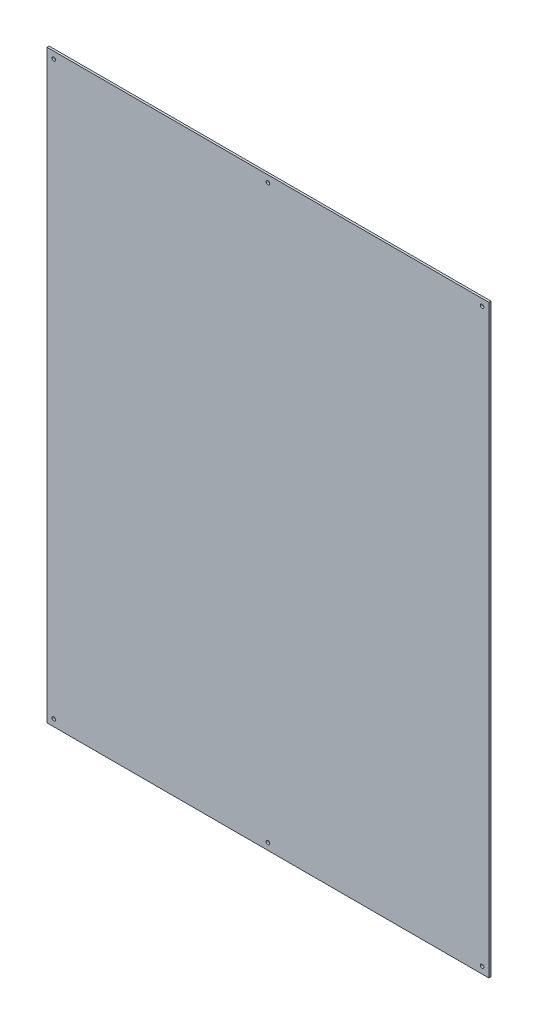
ISO-10303-21;
HEADER;
FILE_DESCRIPTION(('STEP AP214'),'2;1');
FILE_NAME('part.step','',(''),(''),'','','');
FILE_SCHEMA(('AUTOMOTIVE_DESIGN { 1 0 10303 214 1 1 1 1 }'));
ENDSEC;
DATA;
#1=APPLICATION_CONTEXT('core data for automotive mechanical design processes');
#2=APPLICATION_PROTOCOL_DEFINITION('international standard','automotive_design',2000,#1);
#3=PRODUCT_CONTEXT('',#1,'mechanical');
#4=PRODUCT('Part','Part','',(#3));
#5=PRODUCT_RELATED_PRODUCT_CATEGORY('part','',(#4));
#6=PRODUCT_DEFINITION_FORMATION('','',#4);
#7=PRODUCT_DEFINITION_CONTEXT('part definition',#1,'design');
#8=PRODUCT_DEFINITION('design','',#6,#7);
#9=PRODUCT_DEFINITION_SHAPE('','',#8);
#10=(LENGTH_UNIT() NAMED_UNIT(*) SI_UNIT(.MILLI.,.METRE.));
#11=(NAMED_UNIT(*) PLANE_ANGLE_UNIT() SI_UNIT($,.RADIAN.));
#12=(NAMED_UNIT(*) SI_UNIT($,.STERADIAN.) SOLID_ANGLE_UNIT());
#13=UNCERTAINTY_MEASURE_WITH_UNIT(LENGTH_MEASURE(1.E-05),#10,'distance_accuracy_value','');
#14=(GEOMETRIC_REPRESENTATION_CONTEXT(3) GLOBAL_UNCERTAINTY_ASSIGNED_CONTEXT((#13)) GLOBAL_UNIT_ASSIGNED_CONTEXT((#10,
#11,#12)) REPRESENTATION_CONTEXT('',''));
#15=CARTESIAN_POINT('',(0.,0.,0.));
#16=DIRECTION('',(0.,0.,1.));
#17=DIRECTION('',(1.,0.,0.));
#18=AXIS2_PLACEMENT_3D('',#15,#16,#17);
#19=CARTESIAN_POINT('',(0.,0.,3.175));
#20=DIRECTION('',(1.,0.,0.));
#21=DIRECTION('',(0.,0.,-1.));
#22=AXIS2_PLACEMENT_3D('',#19,#20,#21);
#23=PLANE('',#22);
#24=DIRECTION('',(0.,-1.,0.));
#25=VECTOR('',#24,1.);
#26=CARTESIAN_POINT('',(0.,0.,0.));
#27=LINE('',#26,#25);
#28=CARTESIAN_POINT('',(0.,0.,0.));
#29=VERTEX_POINT('',#28);
#30=CARTESIAN_POINT('',(0.,-858.,0.));
#31=VERTEX_POINT('',#30);
#32=EDGE_CURVE('E96',#29,#31,#27,.T.);
#33=ORIENTED_EDGE('',*,*,#32,.T.);
#34=DIRECTION('',(0.,0.,-1.));
#35=VECTOR('',#34,1.);
#36=CARTESIAN_POINT('',(0.,-858.,3.175));
#37=LINE('',#36,#35);
#38=CARTESIAN_POINT('',(0.,-858.,3.175));
#39=VERTEX_POINT('',#38);
#40=EDGE_CURVE('E11',#39,#31,#37,.T.);
#41=ORIENTED_EDGE('',*,*,#40,.F.);
#42=DIRECTION('',(0.,-1.,0.));
#43=VECTOR('',#42,1.);
#44=CARTESIAN_POINT('',(0.,0.,3.175));
#45=LINE('',#44,#43);
#46=CARTESIAN_POINT('',(0.,0.,3.175));
#47=VERTEX_POINT('',#46);
#48=EDGE_CURVE('E84',#47,#39,#45,.T.);
#49=ORIENTED_EDGE('',*,*,#48,.F.);
#50=DIRECTION('',(0.,0.,-1.));
#51=VECTOR('',#50,1.);
#52=CARTESIAN_POINT('',(0.,0.,3.175));
#53=LINE('',#52,#51);
#54=EDGE_CURVE('E92',#47,#29,#53,.T.);
#55=ORIENTED_EDGE('',*,*,#54,.T.);
#56=EDGE_LOOP('',(#33,#41,#49,#55));
#57=FACE_BOUND('',#56,.T.);
#58=ADVANCED_FACE('F33',(#57),#23,.F.);
#59=CARTESIAN_POINT('',(0.,-858.,3.175));
#60=DIRECTION('',(0.,1.,0.));
#61=DIRECTION('',(-1.,0.,0.));
#62=AXIS2_PLACEMENT_3D('',#59,#60,#61);
#63=PLANE('',#62);
#64=DIRECTION('',(1.,0.,0.));
#65=VECTOR('',#64,1.);
#66=CARTESIAN_POINT('',(0.,-858.,0.));
#67=LINE('',#66,#65);
#68=CARTESIAN_POINT('',(648.,-858.,0.));
#69=VERTEX_POINT('',#68);
#70=EDGE_CURVE('E88',#31,#69,#67,.T.);
#71=ORIENTED_EDGE('',*,*,#70,.T.);
#72=DIRECTION('',(0.,0.,-1.));
#73=VECTOR('',#72,1.);
#74=CARTESIAN_POINT('',(648.,-858.,3.175));
#75=LINE('',#74,#73);
#76=CARTESIAN_POINT('',(648.,-858.,3.175));
#77=VERTEX_POINT('',#76);
#78=EDGE_CURVE('E41',#77,#69,#75,.T.);
#79=ORIENTED_EDGE('',*,*,#78,.F.);
#80=DIRECTION('',(1.,0.,0.));
#81=VECTOR('',#80,1.);
#82=CARTESIAN_POINT('',(0.,-858.,3.175));
#83=LINE('',#82,#81);
#84=EDGE_CURVE('E79',#39,#77,#83,.T.);
#85=ORIENTED_EDGE('',*,*,#84,.F.);
#86=ORIENTED_EDGE('',*,*,#40,.T.);
#87=EDGE_LOOP('',(#71,#79,#85,#86));
#88=FACE_BOUND('',#87,.T.);
#89=ADVANCED_FACE('F87',(#88),#63,.F.);
#90=CARTESIAN_POINT('',(648.,1.19035668877123E-13,3.175));
#91=DIRECTION('',(-1.,0.,0.));
#92=DIRECTION('',(0.,-1.,0.));
#93=AXIS2_PLACEMENT_3D('',#90,#91,#92);
#94=PLANE('',#93);
#95=DIRECTION('',(0.,1.,0.));
#96=VECTOR('',#95,1.);
#97=CARTESIAN_POINT('',(648.,1.19035668877123E-13,0.));
#98=LINE('',#97,#96);
#99=CARTESIAN_POINT('',(648.,1.19035668877123E-13,0.));
#100=VERTEX_POINT('',#99);
#101=EDGE_CURVE('E66',#69,#100,#98,.T.);
#102=ORIENTED_EDGE('',*,*,#101,.T.);
#103=DIRECTION('',(0.,0.,-1.));
#104=VECTOR('',#103,1.);
#105=CARTESIAN_POINT('',(648.,1.19035668877123E-13,3.175));
#106=LINE('',#105,#104);
#107=CARTESIAN_POINT('',(648.,1.19035668877123E-13,3.175));
#108=VERTEX_POINT('',#107);
#109=EDGE_CURVE('E89',#108,#100,#106,.T.);
#110=ORIENTED_EDGE('',*,*,#109,.F.);
#111=DIRECTION('',(0.,1.,0.));
#112=VECTOR('',#111,1.);
#113=CARTESIAN_POINT('',(648.,1.19035668877123E-13,3.175));
#114=LINE('',#113,#112);
#115=EDGE_CURVE('E82',#77,#108,#114,.T.);
#116=ORIENTED_EDGE('',*,*,#115,.F.);
#117=ORIENTED_EDGE('',*,*,#78,.T.);
#118=EDGE_LOOP('',(#102,#110,#116,#117));
#119=FACE_BOUND('',#118,.T.);
#120=ADVANCED_FACE('F90',(#119),#94,.F.);
#121=CARTESIAN_POINT('',(0.,0.,3.175));
#122=DIRECTION('',(0.,-1.,0.));
#123=DIRECTION('',(1.,0.,0.));
#124=AXIS2_PLACEMENT_3D('',#121,#122,#123);
#125=PLANE('',#124);
#126=DIRECTION('',(-1.,0.,0.));
#127=VECTOR('',#126,1.);
#128=CARTESIAN_POINT('',(0.,0.,0.));
#129=LINE('',#128,#127);
#130=EDGE_CURVE('E72',#100,#29,#129,.T.);
#131=ORIENTED_EDGE('',*,*,#130,.T.);
#132=ORIENTED_EDGE('',*,*,#54,.F.);
#133=DIRECTION('',(-1.,0.,0.));
#134=VECTOR('',#133,1.);
#135=CARTESIAN_POINT('',(0.,0.,3.175));
#136=LINE('',#135,#134);
#137=EDGE_CURVE('E49',#108,#47,#136,.T.);
#138=ORIENTED_EDGE('',*,*,#137,.F.);
#139=ORIENTED_EDGE('',*,*,#109,.T.);
#140=EDGE_LOOP('',(#131,#132,#138,#139));
#141=FACE_BOUND('',#140,.T.);
#142=ADVANCED_FACE('F104',(#141),#125,.F.);
#143=CARTESIAN_POINT('',(0.,0.,3.175));
#144=DIRECTION('',(0.,0.,1.));
#145=DIRECTION('',(1.,0.,0.));
#146=AXIS2_PLACEMENT_3D('',#143,#144,#145);
#147=PLANE('',#146);
#148=CARTESIAN_POINT('',(9.99999999999986,-10.,3.175));
#149=DIRECTION('',(0.,0.,1.));
#150=DIRECTION('',(-1.,0.,0.));
#151=AXIS2_PLACEMENT_3D('',#148,#149,#150);
#152=CIRCLE('',#151,2.60999999999996);
#153=CARTESIAN_POINT('',(7.38999999999989,-10.,3.175));
#154=VERTEX_POINT('',#153);
#155=EDGE_CURVE('E142',#154,#154,#152,.T.);
#156=ORIENTED_EDGE('',*,*,#155,.F.);
#157=EDGE_LOOP('',(#156));
#158=FACE_BOUND('',#157,.T.);
#159=CARTESIAN_POINT('',(324.,-10.,3.175));
#160=DIRECTION('',(0.,0.,1.));
#161=DIRECTION('',(-1.,0.,0.));
#162=AXIS2_PLACEMENT_3D('',#159,#160,#161);
#163=CIRCLE('',#162,2.60999999999999);
#164=CARTESIAN_POINT('',(321.39,-10.,3.175));
#165=VERTEX_POINT('',#164);
#166=EDGE_CURVE('E136',#165,#165,#163,.T.);
#167=ORIENTED_EDGE('',*,*,#166,.F.);
#168=EDGE_LOOP('',(#167));
#169=FACE_BOUND('',#168,.T.);
#170=CARTESIAN_POINT('',(638.,-9.99999999999979,3.175));
#171=DIRECTION('',(0.,0.,1.));
#172=DIRECTION('',(-1.,0.,0.));
#173=AXIS2_PLACEMENT_3D('',#170,#171,#172);
#174=CIRCLE('',#173,2.61000000000004);
#175=CARTESIAN_POINT('',(635.39,-9.99999999999979,3.175));
#176=VERTEX_POINT('',#175);
#177=EDGE_CURVE('E130',#176,#176,#174,.T.);
#178=ORIENTED_EDGE('',*,*,#177,.F.);
#179=EDGE_LOOP('',(#178));
#180=FACE_BOUND('',#179,.T.);
#181=CARTESIAN_POINT('',(638.,-848.,3.175));
#182=DIRECTION('',(0.,0.,1.));
#183=DIRECTION('',(1.,0.,0.));
#184=AXIS2_PLACEMENT_3D('',#181,#182,#183);
#185=CIRCLE('',#184,2.61000000000004);
#186=CARTESIAN_POINT('',(640.61,-848.,3.175));
#187=VERTEX_POINT('',#186);
#188=EDGE_CURVE('E124',#187,#187,#185,.T.);
#189=ORIENTED_EDGE('',*,*,#188,.F.);
#190=EDGE_LOOP('',(#189));
#191=FACE_BOUND('',#190,.T.);
#192=CARTESIAN_POINT('',(324.,-848.,3.175));
#193=DIRECTION('',(0.,0.,1.));
#194=DIRECTION('',(1.,0.,0.));
#195=AXIS2_PLACEMENT_3D('',#192,#193,#194);
#196=CIRCLE('',#195,2.60999999999999);
#197=CARTESIAN_POINT('',(326.61,-848.,3.175));
#198=VERTEX_POINT('',#197);
#199=EDGE_CURVE('E118',#198,#198,#196,.T.);
#200=ORIENTED_EDGE('',*,*,#199,.F.);
#201=EDGE_LOOP('',(#200));
#202=FACE_BOUND('',#201,.T.);
#203=CARTESIAN_POINT('',(10.,-848.,3.175));
#204=DIRECTION('',(0.,0.,1.));
#205=DIRECTION('',(1.,0.,0.));
#206=AXIS2_PLACEMENT_3D('',#203,#204,#205);
#207=CIRCLE('',#206,2.60999999999996);
#208=CARTESIAN_POINT('',(12.61,-848.,3.175));
#209=VERTEX_POINT('',#208);
#210=EDGE_CURVE('E112',#209,#209,#207,.T.);
#211=ORIENTED_EDGE('',*,*,#210,.F.);
#212=EDGE_LOOP('',(#211));
#213=FACE_BOUND('',#212,.T.);
#214=ORIENTED_EDGE('',*,*,#48,.T.);
#215=ORIENTED_EDGE('',*,*,#84,.T.);
#216=ORIENTED_EDGE('',*,*,#115,.T.);
#217=ORIENTED_EDGE('',*,*,#137,.T.);
#218=EDGE_LOOP('',(#214,#215,#216,#217));
#219=FACE_BOUND('',#218,.T.);
#220=ADVANCED_FACE('F80',(#158,#169,#180,#191,#202,#213,#219),#147,.T.);
#221=CARTESIAN_POINT('',(0.,0.,0.));
#222=DIRECTION('',(0.,0.,1.));
#223=DIRECTION('',(1.,0.,0.));
#224=AXIS2_PLACEMENT_3D('',#221,#222,#223);
#225=PLANE('',#224);
#226=CARTESIAN_POINT('',(9.99999999999986,-10.,0.));
#227=DIRECTION('',(0.,0.,1.));
#228=DIRECTION('',(1.,0.,0.));
#229=AXIS2_PLACEMENT_3D('',#226,#227,#228);
#230=CIRCLE('',#229,2.60999999999996);
#231=CARTESIAN_POINT('',(12.6099999999998,-10.,0.));
#232=VERTEX_POINT('',#231);
#233=EDGE_CURVE('E139',#232,#232,#230,.F.);
#234=ORIENTED_EDGE('',*,*,#233,.F.);
#235=EDGE_LOOP('',(#234));
#236=FACE_BOUND('',#235,.T.);
#237=CARTESIAN_POINT('',(324.,-10.,0.));
#238=DIRECTION('',(0.,0.,1.));
#239=DIRECTION('',(1.,0.,0.));
#240=AXIS2_PLACEMENT_3D('',#237,#238,#239);
#241=CIRCLE('',#240,2.60999999999999);
#242=CARTESIAN_POINT('',(326.61,-10.,0.));
#243=VERTEX_POINT('',#242);
#244=EDGE_CURVE('E133',#243,#243,#241,.F.);
#245=ORIENTED_EDGE('',*,*,#244,.F.);
#246=EDGE_LOOP('',(#245));
#247=FACE_BOUND('',#246,.T.);
#248=CARTESIAN_POINT('',(638.,-9.99999999999979,0.));
#249=DIRECTION('',(0.,0.,1.));
#250=DIRECTION('',(1.,0.,0.));
#251=AXIS2_PLACEMENT_3D('',#248,#249,#250);
#252=CIRCLE('',#251,2.61000000000004);
#253=CARTESIAN_POINT('',(640.61,-9.99999999999979,0.));
#254=VERTEX_POINT('',#253);
#255=EDGE_CURVE('E127',#254,#254,#252,.F.);
#256=ORIENTED_EDGE('',*,*,#255,.F.);
#257=EDGE_LOOP('',(#256));
#258=FACE_BOUND('',#257,.T.);
#259=CARTESIAN_POINT('',(638.,-848.,0.));
#260=DIRECTION('',(0.,0.,1.));
#261=DIRECTION('',(1.,0.,0.));
#262=AXIS2_PLACEMENT_3D('',#259,#260,#261);
#263=CIRCLE('',#262,2.61000000000004);
#264=CARTESIAN_POINT('',(640.61,-848.,0.));
#265=VERTEX_POINT('',#264);
#266=EDGE_CURVE('E121',#265,#265,#263,.F.);
#267=ORIENTED_EDGE('',*,*,#266,.F.);
#268=EDGE_LOOP('',(#267));
#269=FACE_BOUND('',#268,.T.);
#270=CARTESIAN_POINT('',(324.,-848.,0.));
#271=DIRECTION('',(0.,0.,1.));
#272=DIRECTION('',(1.,0.,0.));
#273=AXIS2_PLACEMENT_3D('',#270,#271,#272);
#274=CIRCLE('',#273,2.60999999999999);
#275=CARTESIAN_POINT('',(326.61,-848.,0.));
#276=VERTEX_POINT('',#275);
#277=EDGE_CURVE('E115',#276,#276,#274,.F.);
#278=ORIENTED_EDGE('',*,*,#277,.F.);
#279=EDGE_LOOP('',(#278));
#280=FACE_BOUND('',#279,.T.);
#281=CARTESIAN_POINT('',(10.,-848.,0.));
#282=DIRECTION('',(0.,0.,1.));
#283=DIRECTION('',(1.,0.,0.));
#284=AXIS2_PLACEMENT_3D('',#281,#282,#283);
#285=CIRCLE('',#284,2.60999999999996);
#286=CARTESIAN_POINT('',(12.61,-848.,0.));
#287=VERTEX_POINT('',#286);
#288=EDGE_CURVE('E99',#287,#287,#285,.F.);
#289=ORIENTED_EDGE('',*,*,#288,.F.);
#290=EDGE_LOOP('',(#289));
#291=FACE_BOUND('',#290,.T.);
#292=ORIENTED_EDGE('',*,*,#32,.F.);
#293=ORIENTED_EDGE('',*,*,#130,.F.);
#294=ORIENTED_EDGE('',*,*,#101,.F.);
#295=ORIENTED_EDGE('',*,*,#70,.F.);
#296=EDGE_LOOP('',(#292,#293,#294,#295));
#297=FACE_BOUND('',#296,.T.);
#298=ADVANCED_FACE('F107',(#236,#247,#258,#269,#280,#291,#297),#225,.F.);
#299=CARTESIAN_POINT('',(10.,-848.,-0.00100000000000013));
#300=DIRECTION('',(0.,0.,1.));
#301=DIRECTION('',(1.,0.,0.));
#302=AXIS2_PLACEMENT_3D('',#299,#300,#301);
#303=CYLINDRICAL_SURFACE('',#302,2.60999999999996);
#304=ORIENTED_EDGE('',*,*,#210,.T.);
#305=EDGE_LOOP('',(#304));
#306=FACE_BOUND('',#305,.T.);
#307=ORIENTED_EDGE('',*,*,#288,.T.);
#308=EDGE_LOOP('',(#307));
#309=FACE_BOUND('',#308,.T.);
#310=ADVANCED_FACE('F162',(#306,#309),#303,.F.);
#311=CARTESIAN_POINT('',(324.,-848.,-0.00100000000000013));
#312=DIRECTION('',(0.,0.,1.));
#313=DIRECTION('',(1.,0.,0.));
#314=AXIS2_PLACEMENT_3D('',#311,#312,#313);
#315=CYLINDRICAL_SURFACE('',#314,2.60999999999999);
#316=ORIENTED_EDGE('',*,*,#199,.T.);
#317=EDGE_LOOP('',(#316));
#318=FACE_BOUND('',#317,.T.);
#319=ORIENTED_EDGE('',*,*,#277,.T.);
#320=EDGE_LOOP('',(#319));
#321=FACE_BOUND('',#320,.T.);
#322=ADVANCED_FACE('F165',(#318,#321),#315,.F.);
#323=CARTESIAN_POINT('',(638.,-848.,-0.00100000000000013));
#324=DIRECTION('',(0.,0.,1.));
#325=DIRECTION('',(1.,0.,0.));
#326=AXIS2_PLACEMENT_3D('',#323,#324,#325);
#327=CYLINDRICAL_SURFACE('',#326,2.61000000000004);
#328=ORIENTED_EDGE('',*,*,#188,.T.);
#329=EDGE_LOOP('',(#328));
#330=FACE_BOUND('',#329,.T.);
#331=ORIENTED_EDGE('',*,*,#266,.T.);
#332=EDGE_LOOP('',(#331));
#333=FACE_BOUND('',#332,.T.);
#334=ADVANCED_FACE('F210',(#330,#333),#327,.F.);
#335=CARTESIAN_POINT('',(638.,-9.99999999999979,-0.00100000000000013));
#336=DIRECTION('',(0.,0.,1.));
#337=DIRECTION('',(1.,0.,0.));
#338=AXIS2_PLACEMENT_3D('',#335,#336,#337);
#339=CYLINDRICAL_SURFACE('',#338,2.61000000000004);
#340=ORIENTED_EDGE('',*,*,#177,.T.);
#341=EDGE_LOOP('',(#340));
#342=FACE_BOUND('',#341,.T.);
#343=ORIENTED_EDGE('',*,*,#255,.T.);
#344=EDGE_LOOP('',(#343));
#345=FACE_BOUND('',#344,.T.);
#346=ADVANCED_FACE('F218',(#342,#345),#339,.F.);
#347=CARTESIAN_POINT('',(324.,-10.,-0.00100000000000013));
#348=DIRECTION('',(0.,0.,1.));
#349=DIRECTION('',(1.,0.,0.));
#350=AXIS2_PLACEMENT_3D('',#347,#348,#349);
#351=CYLINDRICAL_SURFACE('',#350,2.60999999999999);
#352=ORIENTED_EDGE('',*,*,#166,.T.);
#353=EDGE_LOOP('',(#352));
#354=FACE_BOUND('',#353,.T.);
#355=ORIENTED_EDGE('',*,*,#244,.T.);
#356=EDGE_LOOP('',(#355));
#357=FACE_BOUND('',#356,.T.);
#358=ADVANCED_FACE('F226',(#354,#357),#351,.F.);
#359=CARTESIAN_POINT('',(9.99999999999986,-10.,-0.00100000000000013));
#360=DIRECTION('',(0.,0.,1.));
#361=DIRECTION('',(1.,0.,0.));
#362=AXIS2_PLACEMENT_3D('',#359,#360,#361);
#363=CYLINDRICAL_SURFACE('',#362,2.60999999999996);
#364=ORIENTED_EDGE('',*,*,#155,.T.);
#365=EDGE_LOOP('',(#364));
#366=FACE_BOUND('',#365,.T.);
#367=ORIENTED_EDGE('',*,*,#233,.T.);
#368=EDGE_LOOP('',(#367));
#369=FACE_BOUND('',#368,.T.);
#370=ADVANCED_FACE('F146',(#366,#369),#363,.F.);
#371=CLOSED_SHELL('',(#58,#89,#120,#142,#220,#298,#310,#322,#334,#346,#358,#370));
#372=MANIFOLD_SOLID_BREP('B2',#371);
#373=ADVANCED_BREP_SHAPE_REPRESENTATION('',(#18,#372),#14);
#374=SHAPE_DEFINITION_REPRESENTATION(#9,#373);
ENDSEC;
END-ISO-10303-21;
